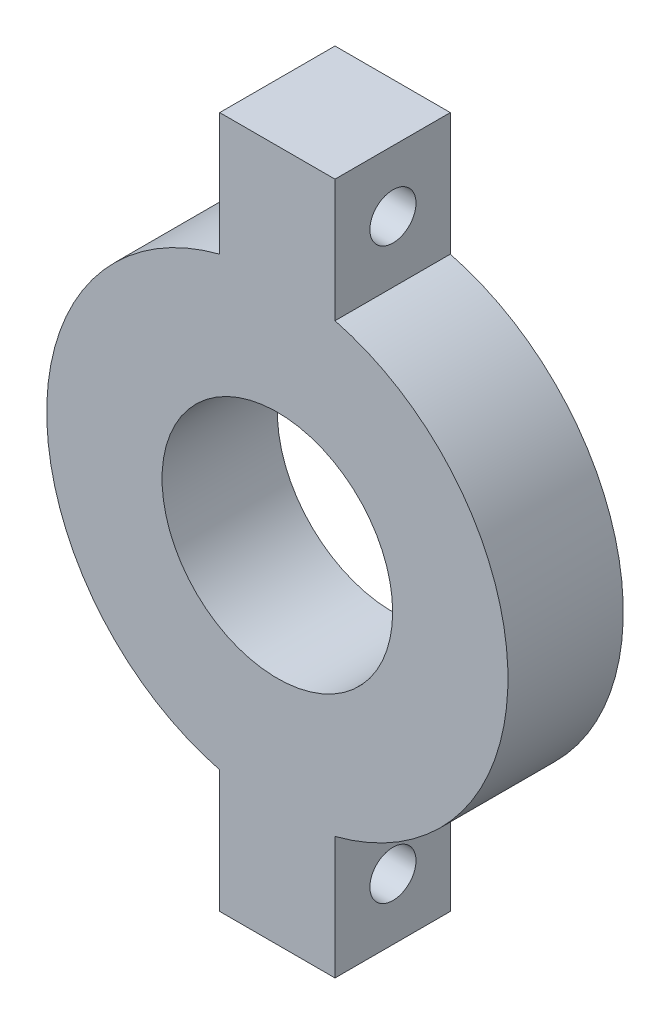
ISO-10303-21;
HEADER;
FILE_DESCRIPTION(('STEP AP214'),'2;1');
FILE_NAME('part.step','',(''),(''),'','','');
FILE_SCHEMA(('AUTOMOTIVE_DESIGN { 1 0 10303 214 1 1 1 1 }'));
ENDSEC;
DATA;
#1=APPLICATION_CONTEXT('core data for automotive mechanical design processes');
#2=APPLICATION_PROTOCOL_DEFINITION('international standard','automotive_design',2000,#1);
#3=PRODUCT_CONTEXT('',#1,'mechanical');
#4=PRODUCT('Part','Part','',(#3));
#5=PRODUCT_RELATED_PRODUCT_CATEGORY('part','',(#4));
#6=PRODUCT_DEFINITION_FORMATION('','',#4);
#7=PRODUCT_DEFINITION_CONTEXT('part definition',#1,'design');
#8=PRODUCT_DEFINITION('design','',#6,#7);
#9=PRODUCT_DEFINITION_SHAPE('','',#8);
#10=(LENGTH_UNIT() NAMED_UNIT(*) SI_UNIT(.MILLI.,.METRE.));
#11=(NAMED_UNIT(*) PLANE_ANGLE_UNIT() SI_UNIT($,.RADIAN.));
#12=(NAMED_UNIT(*) SI_UNIT($,.STERADIAN.) SOLID_ANGLE_UNIT());
#13=UNCERTAINTY_MEASURE_WITH_UNIT(LENGTH_MEASURE(1.E-05),#10,'distance_accuracy_value','');
#14=(GEOMETRIC_REPRESENTATION_CONTEXT(3) GLOBAL_UNCERTAINTY_ASSIGNED_CONTEXT((#13)) GLOBAL_UNIT_ASSIGNED_CONTEXT((#10,
#11,#12)) REPRESENTATION_CONTEXT('',''));
#15=CARTESIAN_POINT('',(0.,0.,0.));
#16=DIRECTION('',(0.,0.,1.));
#17=DIRECTION('',(1.,0.,0.));
#18=AXIS2_PLACEMENT_3D('',#15,#16,#17);
#19=CARTESIAN_POINT('',(0.,0.,5.));
#20=DIRECTION('',(0.,0.,-1.));
#21=DIRECTION('',(-1.,0.,0.));
#22=AXIS2_PLACEMENT_3D('',#19,#20,#21);
#23=CYLINDRICAL_SURFACE('',#22,10.);
#24=DIRECTION('',(0.,0.,-1.));
#25=VECTOR('',#24,1.);
#26=CARTESIAN_POINT('',(2.5,-9.68245836551854,5.));
#27=LINE('',#26,#25);
#28=CARTESIAN_POINT('',(2.5,-9.68245836551854,0.));
#29=VERTEX_POINT('',#28);
#30=CARTESIAN_POINT('',(2.5,-9.68245836551854,5.));
#31=VERTEX_POINT('',#30);
#32=EDGE_CURVE('E11',#29,#31,#27,.F.);
#33=ORIENTED_EDGE('',*,*,#32,.F.);
#34=CARTESIAN_POINT('',(0.,0.,0.));
#35=DIRECTION('',(0.,0.,1.));
#36=DIRECTION('',(1.,0.,0.));
#37=AXIS2_PLACEMENT_3D('',#34,#35,#36);
#38=CIRCLE('',#37,10.);
#39=CARTESIAN_POINT('',(2.5,9.68245836551854,0.));
#40=VERTEX_POINT('',#39);
#41=EDGE_CURVE('E163',#29,#40,#38,.T.);
#42=ORIENTED_EDGE('',*,*,#41,.T.);
#43=DIRECTION('',(0.,0.,-1.));
#44=VECTOR('',#43,1.);
#45=CARTESIAN_POINT('',(2.5,9.68245836551854,5.));
#46=LINE('',#45,#44);
#47=CARTESIAN_POINT('',(2.5,9.68245836551854,5.));
#48=VERTEX_POINT('',#47);
#49=EDGE_CURVE('E174',#40,#48,#46,.F.);
#50=ORIENTED_EDGE('',*,*,#49,.T.);
#51=CARTESIAN_POINT('',(0.,0.,5.));
#52=DIRECTION('',(0.,0.,1.));
#53=DIRECTION('',(1.,0.,0.));
#54=AXIS2_PLACEMENT_3D('',#51,#52,#53);
#55=CIRCLE('',#54,10.);
#56=EDGE_CURVE('E169',#31,#48,#55,.T.);
#57=ORIENTED_EDGE('',*,*,#56,.F.);
#58=EDGE_LOOP('',(#33,#42,#50,#57));
#59=FACE_BOUND('',#58,.T.);
#60=ADVANCED_FACE('F38',(#59),#23,.T.);
#61=DIRECTION('',(0.,0.,-1.));
#62=VECTOR('',#61,1.);
#63=CARTESIAN_POINT('',(-2.5,-9.68245836551854,5.));
#64=LINE('',#63,#62);
#65=CARTESIAN_POINT('',(-2.5,-9.68245836551854,5.));
#66=VERTEX_POINT('',#65);
#67=CARTESIAN_POINT('',(-2.5,-9.68245836551854,0.));
#68=VERTEX_POINT('',#67);
#69=EDGE_CURVE('E45',#66,#68,#64,.T.);
#70=ORIENTED_EDGE('',*,*,#69,.F.);
#71=CARTESIAN_POINT('',(-2.5,9.68245836551854,5.));
#72=VERTEX_POINT('',#71);
#73=EDGE_CURVE('E166',#72,#66,#55,.T.);
#74=ORIENTED_EDGE('',*,*,#73,.F.);
#75=DIRECTION('',(0.,0.,-1.));
#76=VECTOR('',#75,1.);
#77=CARTESIAN_POINT('',(-2.5,9.68245836551854,5.));
#78=LINE('',#77,#76);
#79=CARTESIAN_POINT('',(-2.5,9.68245836551854,0.));
#80=VERTEX_POINT('',#79);
#81=EDGE_CURVE('E168',#72,#80,#78,.T.);
#82=ORIENTED_EDGE('',*,*,#81,.T.);
#83=EDGE_CURVE('E170',#80,#68,#38,.T.);
#84=ORIENTED_EDGE('',*,*,#83,.T.);
#85=EDGE_LOOP('',(#70,#74,#82,#84));
#86=FACE_BOUND('',#85,.T.);
#87=ADVANCED_FACE('F193',(#86),#23,.T.);
#88=CARTESIAN_POINT('',(0.,0.,5.));
#89=DIRECTION('',(0.,0.,1.));
#90=DIRECTION('',(1.,0.,0.));
#91=AXIS2_PLACEMENT_3D('',#88,#89,#90);
#92=PLANE('',#91);
#93=DIRECTION('',(0.,-1.,0.));
#94=VECTOR('',#93,1.);
#95=CARTESIAN_POINT('',(2.5,-8.,5.));
#96=LINE('',#95,#94);
#97=CARTESIAN_POINT('',(2.5,-15.,5.));
#98=VERTEX_POINT('',#97);
#99=EDGE_CURVE('E52',#31,#98,#96,.T.);
#100=ORIENTED_EDGE('',*,*,#99,.F.);
#101=ORIENTED_EDGE('',*,*,#56,.T.);
#102=DIRECTION('',(0.,1.,0.));
#103=VECTOR('',#102,1.);
#104=CARTESIAN_POINT('',(2.5,8.,5.));
#105=LINE('',#104,#103);
#106=CARTESIAN_POINT('',(2.5,15.,5.));
#107=VERTEX_POINT('',#106);
#108=EDGE_CURVE('E142',#48,#107,#105,.T.);
#109=ORIENTED_EDGE('',*,*,#108,.T.);
#110=DIRECTION('',(-1.,0.,0.));
#111=VECTOR('',#110,1.);
#112=CARTESIAN_POINT('',(2.5,15.,5.));
#113=LINE('',#112,#111);
#114=CARTESIAN_POINT('',(-2.5,15.,5.));
#115=VERTEX_POINT('',#114);
#116=EDGE_CURVE('E152',#107,#115,#113,.T.);
#117=ORIENTED_EDGE('',*,*,#116,.T.);
#118=DIRECTION('',(0.,-1.,0.));
#119=VECTOR('',#118,1.);
#120=CARTESIAN_POINT('',(-2.5,8.,5.));
#121=LINE('',#120,#119);
#122=EDGE_CURVE('E58',#115,#72,#121,.T.);
#123=ORIENTED_EDGE('',*,*,#122,.T.);
#124=ORIENTED_EDGE('',*,*,#73,.T.);
#125=DIRECTION('',(0.,1.,0.));
#126=VECTOR('',#125,1.);
#127=CARTESIAN_POINT('',(-2.5,-8.,5.));
#128=LINE('',#127,#126);
#129=CARTESIAN_POINT('',(-2.5,-15.,5.));
#130=VERTEX_POINT('',#129);
#131=EDGE_CURVE('E131',#130,#66,#128,.T.);
#132=ORIENTED_EDGE('',*,*,#131,.F.);
#133=DIRECTION('',(-1.,0.,0.));
#134=VECTOR('',#133,1.);
#135=CARTESIAN_POINT('',(2.5,-15.,5.));
#136=LINE('',#135,#134);
#137=EDGE_CURVE('E119',#98,#130,#136,.T.);
#138=ORIENTED_EDGE('',*,*,#137,.F.);
#139=EDGE_LOOP('',(#100,#101,#109,#117,#123,#124,#132,#138));
#140=FACE_BOUND('',#139,.T.);
#141=CARTESIAN_POINT('',(0.,0.,5.));
#142=DIRECTION('',(0.,0.,1.));
#143=DIRECTION('',(1.,0.,0.));
#144=AXIS2_PLACEMENT_3D('',#141,#142,#143);
#145=CIRCLE('',#144,5.);
#146=CARTESIAN_POINT('',(5.,0.,5.));
#147=VERTEX_POINT('',#146);
#148=EDGE_CURVE('E160',#147,#147,#145,.T.);
#149=ORIENTED_EDGE('',*,*,#148,.F.);
#150=EDGE_LOOP('',(#149));
#151=FACE_BOUND('',#150,.T.);
#152=ADVANCED_FACE('F190',(#140,#151),#92,.T.);
#153=CARTESIAN_POINT('',(0.,0.,0.));
#154=DIRECTION('',(0.,0.,1.));
#155=DIRECTION('',(1.,0.,0.));
#156=AXIS2_PLACEMENT_3D('',#153,#154,#155);
#157=PLANE('',#156);
#158=ORIENTED_EDGE('',*,*,#41,.F.);
#159=DIRECTION('',(0.,-1.,0.));
#160=VECTOR('',#159,1.);
#161=CARTESIAN_POINT('',(2.5,-8.,0.));
#162=LINE('',#161,#160);
#163=CARTESIAN_POINT('',(2.5,-15.,0.));
#164=VERTEX_POINT('',#163);
#165=EDGE_CURVE('E111',#29,#164,#162,.T.);
#166=ORIENTED_EDGE('',*,*,#165,.T.);
#167=DIRECTION('',(-1.,0.,0.));
#168=VECTOR('',#167,1.);
#169=CARTESIAN_POINT('',(2.5,-15.,0.));
#170=LINE('',#169,#168);
#171=CARTESIAN_POINT('',(-2.5,-15.,0.));
#172=VERTEX_POINT('',#171);
#173=EDGE_CURVE('E102',#164,#172,#170,.T.);
#174=ORIENTED_EDGE('',*,*,#173,.T.);
#175=DIRECTION('',(0.,1.,0.));
#176=VECTOR('',#175,1.);
#177=CARTESIAN_POINT('',(-2.5,-8.,0.));
#178=LINE('',#177,#176);
#179=EDGE_CURVE('E109',#172,#68,#178,.T.);
#180=ORIENTED_EDGE('',*,*,#179,.T.);
#181=ORIENTED_EDGE('',*,*,#83,.F.);
#182=DIRECTION('',(0.,-1.,0.));
#183=VECTOR('',#182,1.);
#184=CARTESIAN_POINT('',(-2.5,8.,0.));
#185=LINE('',#184,#183);
#186=CARTESIAN_POINT('',(-2.5,15.,0.));
#187=VERTEX_POINT('',#186);
#188=EDGE_CURVE('E148',#187,#80,#185,.T.);
#189=ORIENTED_EDGE('',*,*,#188,.F.);
#190=DIRECTION('',(-1.,0.,0.));
#191=VECTOR('',#190,1.);
#192=CARTESIAN_POINT('',(2.5,15.,0.));
#193=LINE('',#192,#191);
#194=CARTESIAN_POINT('',(2.5,15.,0.));
#195=VERTEX_POINT('',#194);
#196=EDGE_CURVE('E145',#195,#187,#193,.T.);
#197=ORIENTED_EDGE('',*,*,#196,.F.);
#198=DIRECTION('',(0.,1.,0.));
#199=VECTOR('',#198,1.);
#200=CARTESIAN_POINT('',(2.5,8.,0.));
#201=LINE('',#200,#199);
#202=EDGE_CURVE('E143',#40,#195,#201,.T.);
#203=ORIENTED_EDGE('',*,*,#202,.F.);
#204=EDGE_LOOP('',(#158,#166,#174,#180,#181,#189,#197,#203));
#205=FACE_BOUND('',#204,.T.);
#206=CARTESIAN_POINT('',(0.,0.,0.));
#207=DIRECTION('',(0.,0.,1.));
#208=DIRECTION('',(1.,0.,0.));
#209=AXIS2_PLACEMENT_3D('',#206,#207,#208);
#210=CIRCLE('',#209,5.);
#211=CARTESIAN_POINT('',(5.,0.,0.));
#212=VERTEX_POINT('',#211);
#213=EDGE_CURVE('E157',#212,#212,#210,.T.);
#214=ORIENTED_EDGE('',*,*,#213,.T.);
#215=EDGE_LOOP('',(#214));
#216=FACE_BOUND('',#215,.T.);
#217=ADVANCED_FACE('F105',(#205,#216),#157,.F.);
#218=CARTESIAN_POINT('',(0.,0.,5.));
#219=DIRECTION('',(0.,0.,-1.));
#220=DIRECTION('',(-1.,0.,0.));
#221=AXIS2_PLACEMENT_3D('',#218,#219,#220);
#222=CYLINDRICAL_SURFACE('',#221,5.);
#223=ORIENTED_EDGE('',*,*,#148,.T.);
#224=EDGE_LOOP('',(#223));
#225=FACE_BOUND('',#224,.T.);
#226=ORIENTED_EDGE('',*,*,#213,.F.);
#227=EDGE_LOOP('',(#226));
#228=FACE_BOUND('',#227,.T.);
#229=ADVANCED_FACE('F197',(#225,#228),#222,.F.);
#230=CARTESIAN_POINT('',(2.5,8.,0.));
#231=DIRECTION('',(1.,0.,0.));
#232=DIRECTION('',(0.,1.,0.));
#233=AXIS2_PLACEMENT_3D('',#230,#231,#232);
#234=PLANE('',#233);
#235=CARTESIAN_POINT('',(2.5,12.3458915442409,2.48736407517214));
#236=DIRECTION('',(1.,0.,0.));
#237=DIRECTION('',(0.,1.,0.));
#238=AXIS2_PLACEMENT_3D('',#235,#236,#237);
#239=CIRCLE('',#238,1.);
#240=CARTESIAN_POINT('',(2.5,13.3458915442409,2.48736407517214));
#241=VERTEX_POINT('',#240);
#242=EDGE_CURVE('E139',#241,#241,#239,.T.);
#243=ORIENTED_EDGE('',*,*,#242,.F.);
#244=EDGE_LOOP('',(#243));
#245=FACE_BOUND('',#244,.T.);
#246=ORIENTED_EDGE('',*,*,#49,.F.);
#247=ORIENTED_EDGE('',*,*,#202,.T.);
#248=DIRECTION('',(0.,0.,1.));
#249=VECTOR('',#248,1.);
#250=CARTESIAN_POINT('',(2.5,15.,0.));
#251=LINE('',#250,#249);
#252=EDGE_CURVE('E150',#195,#107,#251,.T.);
#253=ORIENTED_EDGE('',*,*,#252,.T.);
#254=ORIENTED_EDGE('',*,*,#108,.F.);
#255=EDGE_LOOP('',(#246,#247,#253,#254));
#256=FACE_BOUND('',#255,.T.);
#257=ADVANCED_FACE('F183',(#245,#256),#234,.T.);
#258=CARTESIAN_POINT('',(-2.5,8.,0.));
#259=DIRECTION('',(-1.,0.,0.));
#260=DIRECTION('',(0.,0.,1.));
#261=AXIS2_PLACEMENT_3D('',#258,#259,#260);
#262=PLANE('',#261);
#263=CARTESIAN_POINT('',(-2.5,12.3458915442409,2.48736407517214));
#264=DIRECTION('',(-1.,0.,0.));
#265=DIRECTION('',(0.,-1.,0.));
#266=AXIS2_PLACEMENT_3D('',#263,#264,#265);
#267=CIRCLE('',#266,1.);
#268=CARTESIAN_POINT('',(-2.5,11.3458915442409,2.48736407517214));
#269=VERTEX_POINT('',#268);
#270=EDGE_CURVE('E135',#269,#269,#267,.T.);
#271=ORIENTED_EDGE('',*,*,#270,.F.);
#272=EDGE_LOOP('',(#271));
#273=FACE_BOUND('',#272,.T.);
#274=ORIENTED_EDGE('',*,*,#81,.F.);
#275=ORIENTED_EDGE('',*,*,#122,.F.);
#276=DIRECTION('',(0.,0.,1.));
#277=VECTOR('',#276,1.);
#278=CARTESIAN_POINT('',(-2.5,15.,0.));
#279=LINE('',#278,#277);
#280=EDGE_CURVE('E155',#187,#115,#279,.T.);
#281=ORIENTED_EDGE('',*,*,#280,.F.);
#282=ORIENTED_EDGE('',*,*,#188,.T.);
#283=EDGE_LOOP('',(#274,#275,#281,#282));
#284=FACE_BOUND('',#283,.T.);
#285=ADVANCED_FACE('F230',(#273,#284),#262,.T.);
#286=CARTESIAN_POINT('',(2.5,15.,0.));
#287=DIRECTION('',(0.,1.,0.));
#288=DIRECTION('',(0.,0.,1.));
#289=AXIS2_PLACEMENT_3D('',#286,#287,#288);
#290=PLANE('',#289);
#291=ORIENTED_EDGE('',*,*,#116,.F.);
#292=ORIENTED_EDGE('',*,*,#252,.F.);
#293=ORIENTED_EDGE('',*,*,#196,.T.);
#294=ORIENTED_EDGE('',*,*,#280,.T.);
#295=EDGE_LOOP('',(#291,#292,#293,#294));
#296=FACE_BOUND('',#295,.T.);
#297=ADVANCED_FACE('F189',(#296),#290,.T.);
#298=CARTESIAN_POINT('',(7.5,12.3458915442409,2.48736407517214));
#299=DIRECTION('',(-1.,0.,0.));
#300=DIRECTION('',(0.,-1.,0.));
#301=AXIS2_PLACEMENT_3D('',#298,#299,#300);
#302=CYLINDRICAL_SURFACE('',#301,1.);
#303=ORIENTED_EDGE('',*,*,#242,.T.);
#304=EDGE_LOOP('',(#303));
#305=FACE_BOUND('',#304,.T.);
#306=ORIENTED_EDGE('',*,*,#270,.T.);
#307=EDGE_LOOP('',(#306));
#308=FACE_BOUND('',#307,.T.);
#309=ADVANCED_FACE('F216',(#305,#308),#302,.F.);
#310=CARTESIAN_POINT('',(2.5,-8.,0.));
#311=DIRECTION('',(-1.,0.,0.));
#312=DIRECTION('',(0.,-1.,0.));
#313=AXIS2_PLACEMENT_3D('',#310,#311,#312);
#314=PLANE('',#313);
#315=CARTESIAN_POINT('',(2.5,-12.3458915442409,2.48736407517214));
#316=DIRECTION('',(-1.,0.,0.));
#317=DIRECTION('',(0.,-1.,0.));
#318=AXIS2_PLACEMENT_3D('',#315,#316,#317);
#319=CIRCLE('',#318,1.);
#320=CARTESIAN_POINT('',(2.5,-13.3458915442409,2.48736407517214));
#321=VERTEX_POINT('',#320);
#322=EDGE_CURVE('E132',#321,#321,#319,.F.);
#323=ORIENTED_EDGE('',*,*,#322,.F.);
#324=EDGE_LOOP('',(#323));
#325=FACE_BOUND('',#324,.T.);
#326=ORIENTED_EDGE('',*,*,#165,.F.);
#327=ORIENTED_EDGE('',*,*,#32,.T.);
#328=ORIENTED_EDGE('',*,*,#99,.T.);
#329=DIRECTION('',(0.,0.,1.));
#330=VECTOR('',#329,1.);
#331=CARTESIAN_POINT('',(2.5,-15.,0.));
#332=LINE('',#331,#330);
#333=EDGE_CURVE('E122',#164,#98,#332,.T.);
#334=ORIENTED_EDGE('',*,*,#333,.F.);
#335=EDGE_LOOP('',(#326,#327,#328,#334));
#336=FACE_BOUND('',#335,.T.);
#337=ADVANCED_FACE('F214',(#325,#336),#314,.F.);
#338=CARTESIAN_POINT('',(-2.5,-8.,0.));
#339=DIRECTION('',(1.,0.,0.));
#340=DIRECTION('',(0.,0.,-1.));
#341=AXIS2_PLACEMENT_3D('',#338,#339,#340);
#342=PLANE('',#341);
#343=CARTESIAN_POINT('',(-2.5,-12.3458915442409,2.48736407517214));
#344=DIRECTION('',(1.,0.,0.));
#345=DIRECTION('',(0.,1.,0.));
#346=AXIS2_PLACEMENT_3D('',#343,#344,#345);
#347=CIRCLE('',#346,1.);
#348=CARTESIAN_POINT('',(-2.5,-11.3458915442409,2.48736407517214));
#349=VERTEX_POINT('',#348);
#350=EDGE_CURVE('E312',#349,#349,#347,.T.);
#351=ORIENTED_EDGE('',*,*,#350,.T.);
#352=EDGE_LOOP('',(#351));
#353=FACE_BOUND('',#352,.T.);
#354=ORIENTED_EDGE('',*,*,#131,.T.);
#355=ORIENTED_EDGE('',*,*,#69,.T.);
#356=ORIENTED_EDGE('',*,*,#179,.F.);
#357=DIRECTION('',(0.,0.,1.));
#358=VECTOR('',#357,1.);
#359=CARTESIAN_POINT('',(-2.5,-15.,0.));
#360=LINE('',#359,#358);
#361=EDGE_CURVE('E115',#172,#130,#360,.T.);
#362=ORIENTED_EDGE('',*,*,#361,.T.);
#363=EDGE_LOOP('',(#354,#355,#356,#362));
#364=FACE_BOUND('',#363,.T.);
#365=ADVANCED_FACE('F124',(#353,#364),#342,.F.);
#366=CARTESIAN_POINT('',(2.5,-15.,0.));
#367=DIRECTION('',(0.,1.,0.));
#368=DIRECTION('',(0.,0.,1.));
#369=AXIS2_PLACEMENT_3D('',#366,#367,#368);
#370=PLANE('',#369);
#371=ORIENTED_EDGE('',*,*,#137,.T.);
#372=ORIENTED_EDGE('',*,*,#361,.F.);
#373=ORIENTED_EDGE('',*,*,#173,.F.);
#374=ORIENTED_EDGE('',*,*,#333,.T.);
#375=EDGE_LOOP('',(#371,#372,#373,#374));
#376=FACE_BOUND('',#375,.T.);
#377=ADVANCED_FACE('F118',(#376),#370,.F.);
#378=CARTESIAN_POINT('',(7.5,-12.3458915442409,2.48736407517214));
#379=DIRECTION('',(-1.,0.,0.));
#380=DIRECTION('',(0.,-1.,0.));
#381=AXIS2_PLACEMENT_3D('',#378,#379,#380);
#382=CYLINDRICAL_SURFACE('',#381,1.);
#383=ORIENTED_EDGE('',*,*,#350,.F.);
#384=EDGE_LOOP('',(#383));
#385=FACE_BOUND('',#384,.T.);
#386=ORIENTED_EDGE('',*,*,#322,.T.);
#387=EDGE_LOOP('',(#386));
#388=FACE_BOUND('',#387,.T.);
#389=ADVANCED_FACE('F297',(#385,#388),#382,.F.);
#390=CLOSED_SHELL('',(#60,#87,#152,#217,#229,#257,#285,#297,#309,#337,#365,#377,#389));
#391=MANIFOLD_SOLID_BREP('B2',#390);
#392=ADVANCED_BREP_SHAPE_REPRESENTATION('',(#18,#391),#14);
#393=SHAPE_DEFINITION_REPRESENTATION(#9,#392);
ENDSEC;
END-ISO-10303-21;
